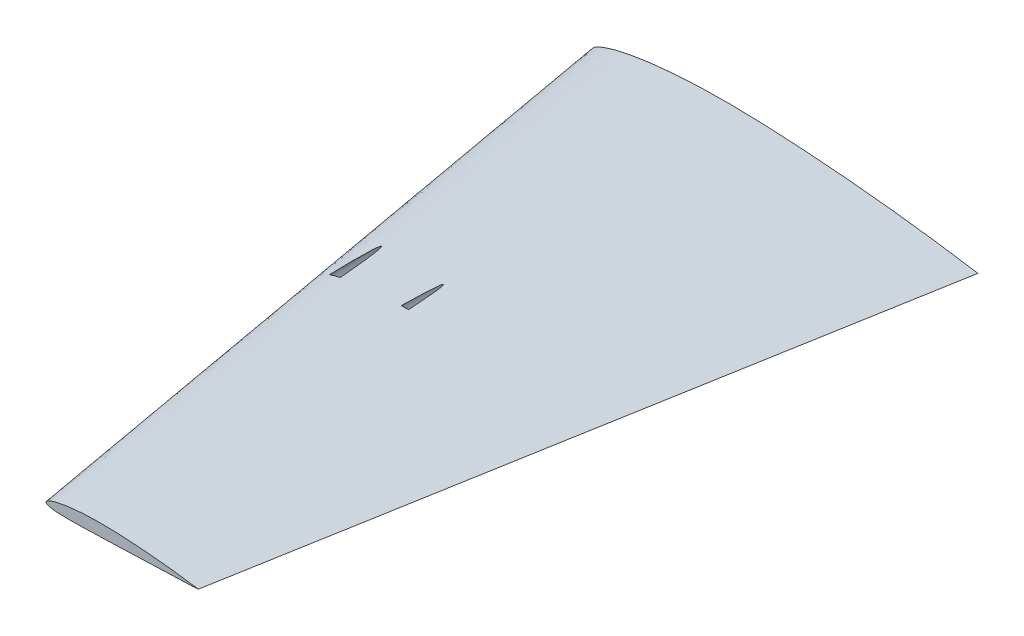
ISO-10303-21;
HEADER;
FILE_DESCRIPTION(('STEP AP214'),'2;1');
FILE_NAME('part.step','',(''),(''),'','','');
FILE_SCHEMA(('AUTOMOTIVE_DESIGN { 1 0 10303 214 1 1 1 1 }'));
ENDSEC;
DATA;
#1=APPLICATION_CONTEXT('core data for automotive mechanical design processes');
#2=APPLICATION_PROTOCOL_DEFINITION('international standard','automotive_design',2000,#1);
#3=PRODUCT_CONTEXT('',#1,'mechanical');
#4=PRODUCT('Part','Part','',(#3));
#5=PRODUCT_RELATED_PRODUCT_CATEGORY('part','',(#4));
#6=PRODUCT_DEFINITION_FORMATION('','',#4);
#7=PRODUCT_DEFINITION_CONTEXT('part definition',#1,'design');
#8=PRODUCT_DEFINITION('design','',#6,#7);
#9=PRODUCT_DEFINITION_SHAPE('','',#8);
#10=(LENGTH_UNIT() NAMED_UNIT(*) SI_UNIT(.MILLI.,.METRE.));
#11=(NAMED_UNIT(*) PLANE_ANGLE_UNIT() SI_UNIT($,.RADIAN.));
#12=(NAMED_UNIT(*) SI_UNIT($,.STERADIAN.) SOLID_ANGLE_UNIT());
#13=UNCERTAINTY_MEASURE_WITH_UNIT(LENGTH_MEASURE(1.E-05),#10,'distance_accuracy_value','');
#14=(GEOMETRIC_REPRESENTATION_CONTEXT(3) GLOBAL_UNCERTAINTY_ASSIGNED_CONTEXT((#13)) GLOBAL_UNIT_ASSIGNED_CONTEXT((#10,
#11,#12)) REPRESENTATION_CONTEXT('',''));
#15=CARTESIAN_POINT('',(0.,0.,0.));
#16=DIRECTION('',(0.,0.,1.));
#17=DIRECTION('',(1.,0.,0.));
#18=AXIS2_PLACEMENT_3D('',#15,#16,#17);
#19=CARTESIAN_POINT('',(55.4064649526419,0.683348343401608,304.8));
#20=DIRECTION('',(0.,0.,-1.));
#21=DIRECTION('',(-1.,0.,0.));
#22=AXIS2_PLACEMENT_3D('',#19,#20,#21);
#23=PLANE('',#22);
#24=CARTESIAN_POINT('',(123.952,-0.210449087184836,304.8));
#25=CARTESIAN_POINT('',(122.790706343836,-0.0342273031484342,304.8));
#26=CARTESIAN_POINT('',(120.467124093883,0.318367242829571,304.8));
#27=CARTESIAN_POINT('',(115.810899397513,0.963076186824327,304.8));
#28=CARTESIAN_POINT('',(109.978584953169,1.67935282167523,304.8));
#29=CARTESIAN_POINT('',(102.9662396439,2.40089084984383,304.8));
#30=CARTESIAN_POINT('',(95.9424731318779,2.98052031405359,304.8));
#31=CARTESIAN_POINT('',(88.9093311385905,3.39949018685831,304.8));
#32=CARTESIAN_POINT('',(81.8568042084218,3.65623455701682,304.8));
#33=CARTESIAN_POINT('',(75.9658797393383,3.64454226280271,304.8));
#34=CARTESIAN_POINT('',(71.2477816960848,3.43544167153705,304.8));
#35=CARTESIAN_POINT('',(67.7128965410631,3.16843628604555,304.8));
#36=CARTESIAN_POINT('',(64.1847212290625,2.77303923837818,304.8));
#37=CARTESIAN_POINT('',(61.2581084835049,2.30694331405794,304.8));
#38=CARTESIAN_POINT('',(58.9281697884809,1.81032736893172,304.8));
#39=CARTESIAN_POINT('',(57.1852042237573,1.37998192647884,304.8));
#40=CARTESIAN_POINT('',(55.7320959132784,0.809837774369731,304.8));
#41=CARTESIAN_POINT('',(54.5654760035073,0.355946309114248,304.8));
#42=CARTESIAN_POINT('',(53.3853953115185,-0.710813052215074,304.8));
#43=CARTESIAN_POINT('',(54.761560506712,-1.49399969401676,304.8));
#44=CARTESIAN_POINT('',(55.9743801762301,-1.75786460812164,304.8));
#45=CARTESIAN_POINT('',(57.5042732088365,-1.98721640481284,304.8));
#46=CARTESIAN_POINT('',(59.2669922488575,-2.11779793837691,304.8));
#47=CARTESIAN_POINT('',(61.6125691962496,-2.21911791515392,304.8));
#48=CARTESIAN_POINT('',(64.5246649381679,-2.2520217936348,304.8));
#49=CARTESIAN_POINT('',(68.0110664044848,-2.21402525142196,304.8));
#50=CARTESIAN_POINT('',(71.4871936874957,-2.13488754961327,304.8));
#51=CARTESIAN_POINT('',(76.1153973510382,-1.99846459470955,304.8));
#52=CARTESIAN_POINT('',(81.9127572556462,-1.81547105963111,304.8));
#53=CARTESIAN_POINT('',(88.8828697086837,-1.58169653441289,304.8));
#54=CARTESIAN_POINT('',(95.8723985528679,-1.310632769524,304.8));
#55=CARTESIAN_POINT('',(102.872094777363,-1.04510946434211,304.8));
#56=CARTESIAN_POINT('',(109.884310300863,-0.79007690257827,304.8));
#57=CARTESIAN_POINT('',(115.736638740901,-0.593669620344815,304.8));
#58=CARTESIAN_POINT('',(119.251823206111,-0.479271837733113,304.8));
#59=CARTESIAN_POINT('',(120.424928472982,-0.44109442695188,304.8));
#60=B_SPLINE_CURVE_WITH_KNOTS('',3,(#24,#25,#26,#27,#28,#29,#30,#31,#32,#33,#34,#35,#36,#37,#38,
#39,#40,#41,#42,#43,#44,#45,#46,#47,#48,#49,#50,#51,#52,#53,#54,#55,#56,#57,#58,#59),
.UNSPECIFIED.,.F.,.F.,(4,1,1,1,1,1,1,1,1,1,1,1,1,1,1,1,1,1,1,1,1,1,1,1,1,1,1,1,1,1,1,1,1,4),(0.,
0.0255158473215281,0.0510535553295715,0.102111638343893,0.153156698624328,0.2041805489657,
0.255198388322243,0.306198821045907,0.357469283972498,0.383114062596156,0.408777820460856,
0.434465463977822,0.460211086520082,0.473144435406998,0.486143688963209,0.499400538642225,
0.506172720054022,0.515220450047496,0.524256147452752,0.531058294108782,0.544124425529066,
0.55697037053682,0.569702534234132,0.595038372382182,0.620262585931604,0.645429077809132,
0.67057348925881,0.720845485800824,0.771430884013805,0.822072719977054,0.872795897802648,
0.923597705730035,0.974502637145741,1.),.UNSPECIFIED.);
#61=CARTESIAN_POINT('',(123.952,-0.210449087184837,304.8));
#62=VERTEX_POINT('',#61);
#63=CARTESIAN_POINT('',(120.424928472982,-0.44109442695188,304.8));
#64=VERTEX_POINT('',#63);
#65=EDGE_CURVE('E186',#62,#64,#60,.T.);
#66=ORIENTED_EDGE('',*,*,#65,.T.);
#67=DIRECTION('',(0.997868719044229,0.0652535022280712,0.));
#68=VECTOR('',#67,1.);
#69=CARTESIAN_POINT('',(120.424928472982,-0.44109442695188,304.8));
#70=LINE('',#69,#68);
#71=EDGE_CURVE('E113',#64,#62,#70,.T.);
#72=ORIENTED_EDGE('',*,*,#71,.T.);
#73=EDGE_LOOP('',(#66,#72));
#74=FACE_BOUND('',#73,.T.);
#75=ADVANCED_FACE('F60',(#74),#23,.F.);
#76=CARTESIAN_POINT('',(3.96627708992465,3.38381364018916,0.));
#77=DIRECTION('',(0.,0.,-1.));
#78=DIRECTION('',(-1.,0.,0.));
#79=AXIS2_PLACEMENT_3D('',#76,#77,#78);
#80=PLANE('',#79);
#81=CARTESIAN_POINT('',(66.6145908322065,3.92359741611896,0.));
#82=DIRECTION('',(0.,0.,-1.));
#83=DIRECTION('',(-1.,0.,0.));
#84=AXIS2_PLACEMENT_3D('',#81,#82,#83);
#85=CIRCLE('',#84,3.556);
#86=CARTESIAN_POINT('',(63.0585908322065,3.92359741611896,0.));
#87=VERTEX_POINT('',#86);
#88=EDGE_CURVE('E327',#87,#87,#85,.T.);
#89=ORIENTED_EDGE('',*,*,#88,.F.);
#90=EDGE_LOOP('',(#89));
#91=FACE_BOUND('',#90,.T.);
#92=CARTESIAN_POINT('',(34.9854091677935,1.15640258388104,0.));
#93=DIRECTION('',(0.,0.,-1.));
#94=DIRECTION('',(-1.,0.,0.));
#95=AXIS2_PLACEMENT_3D('',#92,#93,#94);
#96=CIRCLE('',#95,3.556);
#97=CARTESIAN_POINT('',(31.4294091677935,1.15640258388104,0.));
#98=VERTEX_POINT('',#97);
#99=EDGE_CURVE('E119',#98,#98,#96,.T.);
#100=ORIENTED_EDGE('',*,*,#99,.F.);
#101=EDGE_LOOP('',(#100));
#102=FACE_BOUND('',#101,.T.);
#103=CARTESIAN_POINT('',(177.8,0.149352,0.));
#104=CARTESIAN_POINT('',(174.857195049521,0.612681625122355,0.));
#105=CARTESIAN_POINT('',(168.969063902231,1.53973783273871,0.));
#106=CARTESIAN_POINT('',(157.168969239347,3.2405873734949,0.));
#107=CARTESIAN_POINT('',(142.387066218281,5.13954993005009,0.));
#108=CARTESIAN_POINT('',(124.612423323689,7.06851398771198,0.));
#109=CARTESIAN_POINT('',(106.806810582949,8.63772837976143,0.));
#110=CARTESIAN_POINT('',(88.975151697433,9.79960755707183,0.));
#111=CARTESIAN_POINT('',(71.0920384127062,10.5503213239505,0.));
#112=CARTESIAN_POINT('',(56.1512115576386,10.6038241747413,0.));
#113=CARTESIAN_POINT('',(44.1821401860872,10.1401010113974,0.));
#114=CARTESIAN_POINT('',(35.2131358681503,9.5128163495268,0.));
#115=CARTESIAN_POINT('',(26.2593367738904,8.55980787572253,0.));
#116=CARTESIAN_POINT('',(18.8302327928316,7.41899998659591,0.));
#117=CARTESIAN_POINT('',(12.913992758507,6.19236397962518,0.));
#118=CARTESIAN_POINT('',(8.48737934114215,5.12551854924347,0.));
#119=CARTESIAN_POINT('',(4.79393335490391,3.7000216159676,0.));
#120=CARTESIAN_POINT('',(1.82872511104503,2.56532259711233,0.));
#121=CARTESIAN_POINT('',(-1.17927391697623,-0.123552282536533,0.));
#122=CARTESIAN_POINT('',(2.29992385423439,-2.12930955161099,0.));
#123=CARTESIAN_POINT('',(5.37217276551407,-2.81564850638312,0.));
#124=CARTESIAN_POINT('',(9.24907566939319,-3.41893055998174,0.));
#125=CARTESIAN_POINT('',(13.7178700663076,-3.77499641129469,0.));
#126=CARTESIAN_POINT('',(19.665331559494,-4.06507630656292,0.));
#127=CARTESIAN_POINT('',(27.0505733264275,-4.18963519348183,0.));
#128=CARTESIAN_POINT('',(35.8933797787478,-4.14248221306535,0.));
#129=CARTESIAN_POINT('',(44.7107094282913,-3.99084129943251,0.));
#130=CARTESIAN_POINT('',(56.4507632339333,-3.71017542029488,0.));
#131=CARTESIAN_POINT('',(71.1567081757834,-3.32790041098022,0.));
#132=CARTESIAN_POINT('',(88.8377247038045,-2.83338852479331,0.));
#133=CARTESIAN_POINT('',(106.568511789586,-2.24457712549779,0.));
#134=CARTESIAN_POINT('',(124.32500734663,-1.66996105742068,0.));
#135=CARTESIAN_POINT('',(142.113106471878,-1.12212851342749,0.));
#136=CARTESIAN_POINT('',(156.958652888787,-0.706609275659402,0.));
#137=CARTESIAN_POINT('',(165.875537757121,-0.466092487718349,0.));
#138=CARTESIAN_POINT('',(168.851326,-0.385826,0.));
#139=B_SPLINE_CURVE_WITH_KNOTS('',3,(#103,#104,#105,#106,#107,#108,#109,#110,#111,#112,#113,
#114,#115,#116,#117,#118,#119,#120,#121,#122,#123,#124,#125,#126,#127,#128,#129,#130,#131,#132,
#133,#134,#135,#136,#137,#138),.UNSPECIFIED.,.F.,.F.,(4,1,1,1,1,1,1,1,1,1,1,1,1,1,1,1,1,1,1,1,1,
1,1,1,1,1,1,1,1,1,1,1,1,4),(0.,0.0255158473215281,0.0510535553295715,0.102111638343893,
0.153156698624328,0.2041805489657,0.255198388322243,0.306198821045907,0.357469283972498,
0.383114062596156,0.408777820460856,0.434465463977822,0.460211086520082,0.473144435406998,
0.486143688963209,0.499400538642225,0.506172720054022,0.515220450047496,0.524256147452752,
0.531058294108782,0.544124425529066,0.55697037053682,0.569702534234132,0.595038372382182,
0.620262585931604,0.645429077809132,0.67057348925881,0.720845485800824,0.771430884013805,
0.822072719977054,0.872795897802648,0.923597705730035,0.974502637145741,1.),.UNSPECIFIED.);
#140=CARTESIAN_POINT('',(177.8,0.149352,0.));
#141=VERTEX_POINT('',#140);
#142=CARTESIAN_POINT('',(0.,0.,0.));
#143=VERTEX_POINT('',#142);
#144=EDGE_CURVE('E175',#141,#143,#139,.T.);
#145=ORIENTED_EDGE('',*,*,#144,.F.);
#146=DIRECTION('',(0.998216446900987,0.0596986192166096,0.));
#147=VECTOR('',#146,1.);
#148=CARTESIAN_POINT('',(168.851326,-0.385826,0.));
#149=LINE('',#148,#147);
#150=CARTESIAN_POINT('',(168.851326,-0.385826,0.));
#151=VERTEX_POINT('',#150);
#152=EDGE_CURVE('E184',#151,#141,#149,.T.);
#153=ORIENTED_EDGE('',*,*,#152,.F.);
#154=EDGE_CURVE('E185',#143,#151,#139,.T.);
#155=ORIENTED_EDGE('',*,*,#154,.F.);
#156=EDGE_LOOP('',(#145,#153,#155));
#157=FACE_BOUND('',#156,.T.);
#158=ADVANCED_FACE('F154',(#91,#102,#157),#80,.T.);
#159=CARTESIAN_POINT('',(168.851326,-0.385826,0.));
#160=CARTESIAN_POINT('',(120.424928472982,-0.44109442695188,304.8));
#161=CARTESIAN_POINT('',(170.342771666667,-0.296629666666669,0.));
#162=CARTESIAN_POINT('',(121.012773727485,-0.402653536990706,304.8));
#163=CARTESIAN_POINT('',(171.834217333333,-0.207433333333337,0.));
#164=CARTESIAN_POINT('',(121.600618981988,-0.364212647029531,304.8));
#165=CARTESIAN_POINT('',(174.817108666667,-0.0290406666666699,0.));
#166=CARTESIAN_POINT('',(122.776309490994,-0.287330867107184,304.8));
#167=CARTESIAN_POINT('',(176.308554333333,0.0601556666666645,0.));
#168=CARTESIAN_POINT('',(123.364154745497,-0.24888997714601,304.8));
#169=CARTESIAN_POINT('',(177.8,0.149352,0.));
#170=CARTESIAN_POINT('',(123.952,-0.210449087184837,304.8));
#171=B_SPLINE_SURFACE_WITH_KNOTS('',3,1,((#159,#160),(#161,#162),(#163,#164),(#165,#166),(#167,
#168),(#169,#170)),.UNSPECIFIED.,.F.,.F.,.F.,(4,2,4),(2,2),(0.,0.5,1.),(0.,1.),.UNSPECIFIED.);
#172=DIRECTION('',(-0.173972470029645,-0.00116244770199261,0.984749830356484));
#173=VECTOR('',#172,1.);
#174=CARTESIAN_POINT('',(150.876,-0.0305485435924185,152.4));
#175=LINE('',#174,#173);
#176=EDGE_CURVE('E220',#141,#62,#175,.T.);
#177=DIRECTION('',(0.156911172495344,0.000179080710477262,-0.987612703379334));
#178=VECTOR('',#177,1.);
#179=CARTESIAN_POINT('',(144.638127236491,-0.41346021347594,152.4));
#180=LINE('',#179,#178);
#181=EDGE_CURVE('E203',#64,#151,#180,.T.);
#182=ORIENTED_EDGE('',*,*,#152,.T.);
#183=ORIENTED_EDGE('',*,*,#176,.T.);
#184=ORIENTED_EDGE('',*,*,#71,.F.);
#185=ORIENTED_EDGE('',*,*,#181,.T.);
#186=EDGE_LOOP('',(#182,#183,#184,#185));
#187=FACE_BOUND('',#186,.T.);
#188=ADVANCED_FACE('F157',(#187),#171,.T.);
#189=CARTESIAN_POINT('',(177.8,0.149352,0.));
#190=CARTESIAN_POINT('',(123.952,-0.210449087184836,304.8));
#191=CARTESIAN_POINT('',(174.857195049521,0.612681625122355,0.));
#192=CARTESIAN_POINT('',(122.790706343836,-0.0342273031484342,304.8));
#193=CARTESIAN_POINT('',(168.969063902231,1.53973783273871,0.));
#194=CARTESIAN_POINT('',(120.467124093883,0.318367242829571,304.8));
#195=CARTESIAN_POINT('',(157.168969239347,3.2405873734949,0.));
#196=CARTESIAN_POINT('',(115.810899397513,0.963076186824327,304.8));
#197=CARTESIAN_POINT('',(142.387066218281,5.13954993005009,0.));
#198=CARTESIAN_POINT('',(109.978584953169,1.67935282167523,304.8));
#199=CARTESIAN_POINT('',(124.612423323689,7.06851398771198,0.));
#200=CARTESIAN_POINT('',(102.9662396439,2.40089084984383,304.8));
#201=CARTESIAN_POINT('',(106.806810582949,8.63772837976143,0.));
#202=CARTESIAN_POINT('',(95.9424731318779,2.98052031405359,304.8));
#203=CARTESIAN_POINT('',(88.975151697433,9.79960755707183,0.));
#204=CARTESIAN_POINT('',(88.9093311385905,3.39949018685831,304.8));
#205=CARTESIAN_POINT('',(71.0920384127062,10.5503213239505,0.));
#206=CARTESIAN_POINT('',(81.8568042084218,3.65623455701682,304.8));
#207=CARTESIAN_POINT('',(56.1512115576386,10.6038241747413,0.));
#208=CARTESIAN_POINT('',(75.9658797393383,3.64454226280271,304.8));
#209=CARTESIAN_POINT('',(44.1821401860872,10.1401010113974,0.));
#210=CARTESIAN_POINT('',(71.2477816960848,3.43544167153705,304.8));
#211=CARTESIAN_POINT('',(35.2131358681503,9.5128163495268,0.));
#212=CARTESIAN_POINT('',(67.7128965410631,3.16843628604555,304.8));
#213=CARTESIAN_POINT('',(26.2593367738904,8.55980787572253,0.));
#214=CARTESIAN_POINT('',(64.1847212290625,2.77303923837818,304.8));
#215=CARTESIAN_POINT('',(18.8302327928316,7.41899998659591,0.));
#216=CARTESIAN_POINT('',(61.2581084835049,2.30694331405794,304.8));
#217=CARTESIAN_POINT('',(12.913992758507,6.19236397962518,0.));
#218=CARTESIAN_POINT('',(58.9281697884809,1.81032736893172,304.8));
#219=CARTESIAN_POINT('',(8.48737934114215,5.12551854924347,0.));
#220=CARTESIAN_POINT('',(57.1852042237573,1.37998192647884,304.8));
#221=CARTESIAN_POINT('',(4.79393335490391,3.7000216159676,0.));
#222=CARTESIAN_POINT('',(55.7320959132784,0.809837774369731,304.8));
#223=CARTESIAN_POINT('',(1.82872511104503,2.56532259711233,0.));
#224=CARTESIAN_POINT('',(54.5654760035073,0.355946309114248,304.8));
#225=CARTESIAN_POINT('',(-1.17927391697623,-0.123552282536533,0.));
#226=CARTESIAN_POINT('',(53.3853953115185,-0.710813052215074,304.8));
#227=CARTESIAN_POINT('',(2.29992385423439,-2.12930955161099,0.));
#228=CARTESIAN_POINT('',(54.761560506712,-1.49399969401676,304.8));
#229=CARTESIAN_POINT('',(5.37217276551407,-2.81564850638312,0.));
#230=CARTESIAN_POINT('',(55.9743801762301,-1.75786460812164,304.8));
#231=CARTESIAN_POINT('',(9.24907566939319,-3.41893055998174,0.));
#232=CARTESIAN_POINT('',(57.5042732088365,-1.98721640481284,304.8));
#233=CARTESIAN_POINT('',(13.7178700663076,-3.77499641129469,0.));
#234=CARTESIAN_POINT('',(59.2669922488575,-2.11779793837691,304.8));
#235=CARTESIAN_POINT('',(19.665331559494,-4.06507630656292,0.));
#236=CARTESIAN_POINT('',(61.6125691962496,-2.21911791515392,304.8));
#237=CARTESIAN_POINT('',(27.0505733264275,-4.18963519348183,0.));
#238=CARTESIAN_POINT('',(64.5246649381679,-2.2520217936348,304.8));
#239=CARTESIAN_POINT('',(35.8933797787478,-4.14248221306535,0.));
#240=CARTESIAN_POINT('',(68.0110664044848,-2.21402525142196,304.8));
#241=CARTESIAN_POINT('',(44.7107094282913,-3.99084129943251,0.));
#242=CARTESIAN_POINT('',(71.4871936874957,-2.13488754961327,304.8));
#243=CARTESIAN_POINT('',(56.4507632339333,-3.71017542029488,0.));
#244=CARTESIAN_POINT('',(76.1153973510382,-1.99846459470955,304.8));
#245=CARTESIAN_POINT('',(71.1567081757834,-3.32790041098022,0.));
#246=CARTESIAN_POINT('',(81.9127572556462,-1.81547105963111,304.8));
#247=CARTESIAN_POINT('',(88.8377247038045,-2.83338852479331,0.));
#248=CARTESIAN_POINT('',(88.8828697086837,-1.58169653441289,304.8));
#249=CARTESIAN_POINT('',(106.568511789586,-2.24457712549779,0.));
#250=CARTESIAN_POINT('',(95.8723985528679,-1.310632769524,304.8));
#251=CARTESIAN_POINT('',(124.32500734663,-1.66996105742068,0.));
#252=CARTESIAN_POINT('',(102.872094777363,-1.04510946434211,304.8));
#253=CARTESIAN_POINT('',(142.113106471878,-1.12212851342749,0.));
#254=CARTESIAN_POINT('',(109.884310300863,-0.79007690257827,304.8));
#255=CARTESIAN_POINT('',(156.958652888787,-0.706609275659402,0.));
#256=CARTESIAN_POINT('',(115.736638740901,-0.593669620344815,304.8));
#257=CARTESIAN_POINT('',(165.875537757121,-0.466092487718349,0.));
#258=CARTESIAN_POINT('',(119.251823206111,-0.479271837733113,304.8));
#259=CARTESIAN_POINT('',(168.851326,-0.385826,0.));
#260=CARTESIAN_POINT('',(120.424928472982,-0.44109442695188,304.8));
#261=B_SPLINE_SURFACE_WITH_KNOTS('',3,1,((#189,#190),(#191,#192),(#193,#194),(#195,#196),(#197,
#198),(#199,#200),(#201,#202),(#203,#204),(#205,#206),(#207,#208),(#209,#210),(#211,#212),(#213,
#214),(#215,#216),(#217,#218),(#219,#220),(#221,#222),(#223,#224),(#225,#226),(#227,#228),(#229,
#230),(#231,#232),(#233,#234),(#235,#236),(#237,#238),(#239,#240),(#241,#242),(#243,#244),(#245,
#246),(#247,#248),(#249,#250),(#251,#252),(#253,#254),(#255,#256),(#257,#258),(#259,#260)),
.UNSPECIFIED.,.F.,.F.,.F.,(4,1,1,1,1,1,1,1,1,1,1,1,1,1,1,1,1,1,1,1,1,1,1,1,1,1,1,1,1,1,1,1,1,4),
(2,2),(0.,0.0255158473215281,0.0510535553295715,0.102111638343893,0.153156698624328,
0.2041805489657,0.255198388322243,0.306198821045907,0.357469283972498,0.383114062596156,
0.408777820460856,0.434465463977822,0.460211086520082,0.473144435406998,0.486143688963209,
0.499400538642225,0.506172720054022,0.515220450047496,0.524256147452752,0.531058294108782,
0.544124425529066,0.55697037053682,0.569702534234132,0.595038372382182,0.620262585931604,
0.645429077809132,0.67057348925881,0.720845485800824,0.771430884013805,0.822072719977054,
0.872795897802648,0.923597705730035,0.974502637145741,1.),(0.,1.),.UNSPECIFIED.);
#262=CARTESIAN_POINT('',(68.2466219190827,7.08296610803387,152.4));
#263=CARTESIAN_POINT('',(68.2336056626302,7.08968952080345,152.105104138697));
#264=CARTESIAN_POINT('',(68.220397251114,7.09641103535035,151.810216666588));
#265=CARTESIAN_POINT('',(68.1935634647631,7.10985026873692,151.220450628958));
#266=CARTESIAN_POINT('',(68.1799380758596,7.11656798744073,150.925572064073));
#267=CARTESIAN_POINT('',(68.152238256637,7.12999932105125,150.335829506722));
#268=CARTESIAN_POINT('',(68.1381638166023,7.13671293586596,150.040965514711));
#269=CARTESIAN_POINT('',(68.1095278933859,7.15013569954822,149.451258078269));
#270=CARTESIAN_POINT('',(68.0949664052962,7.15684484837006,149.156414634076));
#271=CARTESIAN_POINT('',(68.065205200744,7.17030692634001,148.564615428296));
#272=CARTESIAN_POINT('',(68.0500016205664,7.17705982000171,148.267659859987));
#273=CARTESIAN_POINT('',(68.0190039417406,7.19056016930604,147.673782419764));
#274=CARTESIAN_POINT('',(68.0032098491102,7.19730762500338,147.376860547537));
#275=CARTESIAN_POINT('',(67.9709696285039,7.21079651963321,146.783057605419));
#276=CARTESIAN_POINT('',(67.9545235127598,7.21753795867614,146.486176534867));
#277=CARTESIAN_POINT('',(67.9209057637668,7.23101412608039,145.892462941095));
#278=CARTESIAN_POINT('',(67.9037341492406,7.23774885461028,145.595630416821));
#279=CARTESIAN_POINT('',(67.8685791659822,7.25120970472832,145.002068846046));
#280=CARTESIAN_POINT('',(67.8505959495347,7.2579358276896,144.705339790573));
#281=CARTESIAN_POINT('',(67.8137050763819,7.27137975287607,144.111936121035));
#282=CARTESIAN_POINT('',(67.7947974112621,7.27809755502495,143.815261507489));
#283=CARTESIAN_POINT('',(67.7559194885991,7.29152378485072,143.221965866651));
#284=CARTESIAN_POINT('',(67.7359491753119,7.29823221201685,142.925344842991));
#285=CARTESIAN_POINT('',(67.6947688871545,7.31163823628542,142.332157980842));
#286=CARTESIAN_POINT('',(67.6735587863613,7.31833583221651,142.035592151038));
#287=CARTESIAN_POINT('',(67.6298095594315,7.33167412528554,141.444471729499));
#288=CARTESIAN_POINT('',(67.6072798374181,7.33831491170697,141.149916446273));
#289=CARTESIAN_POINT('',(67.5604607834405,7.35157918122746,140.560951836961));
#290=CARTESIAN_POINT('',(67.5361714951223,7.3582026647515,140.266542507438));
#291=CARTESIAN_POINT('',(67.4853951137922,7.37142634520685,139.677963037011));
#292=CARTESIAN_POINT('',(67.4589083983133,7.37802654593599,139.383792863753));
#293=CARTESIAN_POINT('',(67.4030882461765,7.39119539096865,138.795798328661));
#294=CARTESIAN_POINT('',(67.3737555881239,7.39776404339004,138.50197389438));
#295=CARTESIAN_POINT('',(67.3323132971702,7.40642898939049,138.113370174743));
#296=CARTESIAN_POINT('',(67.3219759404733,7.40854477426729,138.018401804018));
#297=CARTESIAN_POINT('',(67.3008244278623,7.41277157313944,137.828493426061));
#298=CARTESIAN_POINT('',(67.2900101512721,7.41488258578356,137.733553432199));
#299=CARTESIAN_POINT('',(67.2678342123732,7.41909973653993,137.543677862107));
#300=CARTESIAN_POINT('',(67.2564722170232,7.42120587084907,137.448742324613));
#301=CARTESIAN_POINT('',(67.2329659496718,7.42543876666726,137.257686838156));
#302=CARTESIAN_POINT('',(67.2208132881398,7.42756543032685,137.161567915923));
#303=CARTESIAN_POINT('',(67.1957559389795,7.43180843384714,136.969485322806));
#304=CARTESIAN_POINT('',(67.1828516993134,7.43392477905895,136.87352159378));
#305=CARTESIAN_POINT('',(67.1561590772798,7.43814182005847,136.681923148465));
#306=CARTESIAN_POINT('',(67.1423726234071,7.44024253948359,136.586288165647));
#307=CARTESIAN_POINT('',(67.117158234909,7.4439216021536,136.418378398078));
#308=CARTESIAN_POINT('',(67.1059700383851,7.44550297725983,136.346067751325));
#309=CARTESIAN_POINT('',(67.0828128582125,7.44865641252974,136.201535912933));
#310=CARTESIAN_POINT('',(67.0708435095933,7.45022846795946,136.129314779408));
#311=CARTESIAN_POINT('',(67.0459058181478,7.45336542095588,135.984778474128));
#312=CARTESIAN_POINT('',(67.0329340640547,7.45493027298551,135.91246388591));
#313=CARTESIAN_POINT('',(67.0056730288018,7.45805358005368,135.767574424789));
#314=CARTESIAN_POINT('',(66.9913754157822,7.45961191990011,135.695001108387));
#315=CARTESIAN_POINT('',(66.9614517801776,7.46267168690731,135.551746471575));
#316=CARTESIAN_POINT('',(66.9458608476044,7.46417361776065,135.481057969877));
#317=CARTESIAN_POINT('',(66.9207884537237,7.46639975042604,135.375471025335));
#318=CARTESIAN_POINT('',(66.9121559531246,7.46713687844864,135.3403716325));
#319=CARTESIAN_POINT('',(66.8941893153032,7.46859984715532,135.270362773359));
#320=CARTESIAN_POINT('',(66.8848553894594,7.46932569116096,135.235453253208));
#321=CARTESIAN_POINT('',(66.8653822429473,7.47075604849572,135.166207729751));
#322=CARTESIAN_POINT('',(66.8552513487032,7.47146069766024,135.13186941441));
#323=CARTESIAN_POINT('',(66.8338017379794,7.4728506106675,135.063519553984));
#324=CARTESIAN_POINT('',(66.8224816561337,7.4735358510548,135.02950843455));
#325=CARTESIAN_POINT('',(66.7982808796083,7.47487073609284,134.962342981947));
#326=CARTESIAN_POINT('',(66.7854139515793,7.47552062944881,134.929183874855));
#327=CARTESIAN_POINT('',(66.7641934971269,7.4764559713231,134.880309861071));
#328=CARTESIAN_POINT('',(66.7568076829062,7.47676090627648,134.864177088226));
#329=CARTESIAN_POINT('',(66.741179027941,7.47735223488249,134.832334813522));
#330=CARTESIAN_POINT('',(66.7329367757868,7.47763864105231,134.816625030188));
#331=CARTESIAN_POINT('',(66.7199722337007,7.4780379518142,134.794091757391));
#332=CARTESIAN_POINT('',(66.715718278581,7.47816189425824,134.78699924142));
#333=CARTESIAN_POINT('',(66.7068928996997,7.47840203961349,134.77300723508));
#334=CARTESIAN_POINT('',(66.7023213017619,7.47851823820893,134.766107853569));
#335=CARTESIAN_POINT('',(66.6928216692539,7.478739944329,134.752610578958));
#336=CARTESIAN_POINT('',(66.687895625444,7.4788455046259,134.746011296912));
#337=CARTESIAN_POINT('',(66.6775814536355,7.47904321498242,134.733184043053));
#338=CARTESIAN_POINT('',(66.6721935813292,7.47913537238733,134.726955868972));
#339=CARTESIAN_POINT('',(66.6616549745886,7.47928927661305,134.715892690474));
#340=CARTESIAN_POINT('',(66.6565806110032,7.47935348794625,134.710985854));
#341=CARTESIAN_POINT('',(66.6459128450891,7.47946347861309,134.70173132105));
#342=CARTESIAN_POINT('',(66.6403181850812,7.47950921177695,134.697385043396));
#343=CARTESIAN_POINT('',(66.6284557857111,7.47957541565957,134.689474634157));
#344=CARTESIAN_POINT('',(66.6221788022394,7.47959547548619,134.6859239568));
#345=CARTESIAN_POINT('',(66.6090540640259,7.47959906137061,134.680125927745));
#346=CARTESIAN_POINT('',(66.6022092559138,7.47958276591281,134.677872276728));
#347=CARTESIAN_POINT('',(66.5904466838544,7.47951862842015,134.675530369163));
#348=CARTESIAN_POINT('',(66.585621241254,7.47948268688359,134.674977628296));
#349=CARTESIAN_POINT('',(66.5759473459688,7.47939074268986,134.67471179197));
#350=CARTESIAN_POINT('',(66.5710988924475,7.47933473929773,134.674998727276));
#351=CARTESIAN_POINT('',(66.5567824754681,7.47914012371183,134.677084016295));
#352=CARTESIAN_POINT('',(66.547483643319,7.47897456376297,134.680095640842));
#353=CARTESIAN_POINT('',(66.5316499729119,7.47863737402354,134.687561403319));
#354=CARTESIAN_POINT('',(66.524921468559,7.47847247517907,134.691647818518));
#355=CARTESIAN_POINT('',(66.5121325017516,7.47812675872809,134.700779497983));
#356=CARTESIAN_POINT('',(66.5060742140924,7.47794589253619,134.705827746935));
#357=CARTESIAN_POINT('',(66.4930376762509,7.477526814104,134.717952793929));
#358=CARTESIAN_POINT('',(66.4862353335721,7.47728601040182,134.725214245663));
#359=CARTESIAN_POINT('',(66.4733627311795,7.47679764066251,134.740334756823));
#360=CARTESIAN_POINT('',(66.4672919569725,7.47655007952978,134.748193389849));
#361=CARTESIAN_POINT('',(66.4556773948406,7.47604959837295,134.764360856877));
#362=CARTESIAN_POINT('',(66.4501371434897,7.47579665450449,134.772672201025));
#363=CARTESIAN_POINT('',(66.4395100424003,7.47528868490849,134.789575015134));
#364=CARTESIAN_POINT('',(66.4344231333901,7.47503365945787,134.798166448273));
#365=CARTESIAN_POINT('',(66.4201365631849,7.47428924011963,134.823482660763));
#366=CARTESIAN_POINT('',(66.4114178950687,7.47379825460979,134.84047798674));
#367=CARTESIAN_POINT('',(66.3949123112822,7.47281490895148,134.87491856378));
#368=CARTESIAN_POINT('',(66.3871260578766,7.47232254807716,134.892364124065));
#369=CARTESIAN_POINT('',(66.3647783197149,7.47084360829624,134.945201900902));
#370=CARTESIAN_POINT('',(66.3512600924062,7.46985697033533,134.981033092069));
#371=CARTESIAN_POINT('',(66.3259414700926,7.46788522848604,135.053341396858));
#372=CARTESIAN_POINT('',(66.3141439653525,7.46690012986686,135.089819484397));
#373=CARTESIAN_POINT('',(66.2918008199745,7.46493441051151,135.163099881736));
#374=CARTESIAN_POINT('',(66.2812534730491,7.46395378547017,135.199901674228));
#375=CARTESIAN_POINT('',(66.2511879774172,7.46103725320442,135.30988243133));
#376=CARTESIAN_POINT('',(66.2329907600665,7.45910552822361,135.383419599215));
#377=CARTESIAN_POINT('',(66.1988360182799,7.45525062826446,135.531018219546));
#378=CARTESIAN_POINT('',(66.1828791078359,7.45332745576937,135.605079809899));
#379=CARTESIAN_POINT('',(66.1525505269864,7.4494857980109,135.753616004211));
#380=CARTESIAN_POINT('',(66.1381807443107,7.44756732092746,135.828090991657));
#381=CARTESIAN_POINT('',(66.1106531011314,7.44373584078279,135.97726581393));
#382=CARTESIAN_POINT('',(66.0974952951187,7.44182283797143,136.051965658712));
#383=CARTESIAN_POINT('',(66.059490155285,7.43609797532761,136.276009696475));
#384=CARTESIAN_POINT('',(66.0360534609057,7.43229266954471,136.425592873695));
#385=CARTESIAN_POINT('',(65.9917432868584,7.42469661692719,136.725028479875));
#386=CARTESIAN_POINT('',(65.9708681113291,7.42090586208736,136.874880663322));
#387=CARTESIAN_POINT('',(65.9244309930454,7.4120851026014,137.224253837047));
#388=CARTESIAN_POINT('',(65.8995913027632,7.40705834489564,137.423870564825));
#389=CARTESIAN_POINT('',(65.8522983844918,7.39701455253608,137.82338885778));
#390=CARTESIAN_POINT('',(65.8298452309673,7.39199751819047,138.023290431647));
#391=CARTESIAN_POINT('',(65.7867631532961,7.3819679480631,138.423375744815));
#392=CARTESIAN_POINT('',(65.7661350132092,7.37695541512184,138.623559568215));
#393=CARTESIAN_POINT('',(65.726343732315,7.3669347832676,139.024073306581));
#394=CARTESIAN_POINT('',(65.7071806016993,7.3619266843857,139.224403222555));
#395=CARTESIAN_POINT('',(65.6514767083532,7.34690506623637,139.82562011531));
#396=CARTESIAN_POINT('',(65.6167278387342,7.33689575505448,140.226673153553));
#397=CARTESIAN_POINT('',(65.5506490524863,7.31687715078627,141.029179489644));
#398=CARTESIAN_POINT('',(65.5193201830446,7.30686785863867,141.430632872317));
#399=CARTESIAN_POINT('',(65.4593106581956,7.28684941055601,142.233655967636));
#400=CARTESIAN_POINT('',(65.4306294750118,7.27684025499318,142.635225641023));
#401=CARTESIAN_POINT('',(65.375380750736,7.25681733262736,143.438487989494));
#402=CARTESIAN_POINT('',(65.3488130984238,7.24680356609495,143.840180656988));
#403=CARTESIAN_POINT('',(65.2807912340857,7.22029048799675,144.903474816459));
#404=CARTESIAN_POINT('',(65.2408204398261,7.20378474450491,145.565170962553));
#405=CARTESIAN_POINT('',(65.1644557380508,7.17074505710119,146.888802043255));
#406=CARTESIAN_POINT('',(65.1280620217933,7.15421111172945,147.550736988733));
#407=CARTESIAN_POINT('',(65.0581483175433,7.12111482644315,148.874619471928));
#408=CARTESIAN_POINT('',(65.024627735034,7.1045524931297,149.536566978553));
#409=CARTESIAN_POINT('',(64.9599493162665,7.07139299817188,150.860567475422));
#410=CARTESIAN_POINT('',(64.9287914491164,7.05479583698581,151.522620464173));
#411=CARTESIAN_POINT('',(64.8953642327681,7.03637907665285,152.256478158388));
#412=CARTESIAN_POINT('',(64.8921072973428,7.03457797713656,152.328238825424));
#413=CARTESIAN_POINT('',(64.8888618694052,7.03277665619969,152.4));
#414=B_SPLINE_CURVE_WITH_KNOTS('',3,(#262,#263,#264,#265,#266,#267,#268,#269,#270,#271,#272,
#273,#274,#275,#276,#277,#278,#279,#280,#281,#282,#283,#284,#285,#286,#287,#288,#289,#290,#291,
#292,#293,#294,#295,#296,#297,#298,#299,#300,#301,#302,#303,#304,#305,#306,#307,#308,#309,#310,
#311,#312,#313,#314,#315,#316,#317,#318,#319,#320,#321,#322,#323,#324,#325,#326,#327,#328,#329,
#330,#331,#332,#333,#334,#335,#336,#337,#338,#339,#340,#341,#342,#343,#344,#345,#346,#347,#348,
#349,#350,#351,#352,#353,#354,#355,#356,#357,#358,#359,#360,#361,#362,#363,#364,#365,#366,#367,
#368,#369,#370,#371,#372,#373,#374,#375,#376,#377,#378,#379,#380,#381,#382,#383,#384,#385,#386,
#387,#388,#389,#390,#391,#392,#393,#394,#395,#396,#397,#398,#399,#400,#401,#402,#403,#404,#405,
#406,#407,#408,#409,#410,#411,#412,#413),.UNSPECIFIED.,.F.,.F.,(4,2,2,2,2,2,2,2,2,2,2,2,2,2,2,2,
2,2,2,2,2,2,2,2,2,2,2,2,2,2,2,2,2,2,2,2,2,2,2,2,2,2,2,2,2,2,2,2,2,2,2,2,2,2,2,2,2,2,2,2,2,2,2,2,
2,2,2,2,2,2,2,2,2,2,2,4),(0.,0.885778630942354,1.77158718101904,2.657414909673,3.54325156759388,
4.43551458142685,5.32776850504834,6.2200056982353,7.1122198797743,8.00426734140414,
8.89632292393029,9.78842534770823,10.6806185385896,11.56708519944,12.4535298791065,
13.3398225757375,14.2258734766649,14.5125308323405,14.7992611424597,15.0861680543691,
15.3768878850482,15.6674361772126,15.957369709219,16.1769308045852,16.3965952282433,
16.6170432300967,16.8389849651625,17.056164077452,17.1646171835934,17.2730377368478,
17.3804466692642,17.4879802997512,17.5946193273758,17.647840925969,17.7010261867471,
17.725834022579,17.7506555705475,17.7753472066375,17.8000252593744,17.821172364488,
17.8423719860366,17.8639068224897,17.885336167529,17.8998383007351,17.9143409652798,
17.9431734851522,17.966696993434,17.9902947232671,18.0200862703098,18.0498567419166,
18.0798135638764,18.1097664633935,18.1670411439129,18.2243562665324,18.3391958518185,
18.4542261628217,18.569097620454,18.7963725157818,19.0237095783324,19.2513141881136,
19.4789290260904,19.9332585102122,20.3872855623502,20.9909204972754,21.5945742613191,
22.1984861195509,22.8024021785966,24.010418591805,25.2188038622764,26.4269477368112,
27.635027993118,29.6243370742476,31.6137524614264,33.6027551944277,35.5917319173279,
35.8073032558112),.UNSPECIFIED.);
#415=CARTESIAN_POINT('',(68.2466219190933,7.08296610803115,152.4));
#416=VERTEX_POINT('',#415);
#417=CARTESIAN_POINT('',(64.8888618693942,7.03277665619945,152.4));
#418=VERTEX_POINT('',#417);
#419=EDGE_CURVE('E12',#416,#418,#414,.T.);
#420=CARTESIAN_POINT('',(70.2132628322065,7.09105554281612,152.4));
#421=CARTESIAN_POINT('',(69.9133142025782,7.09096184293044,152.4));
#422=CARTESIAN_POINT('',(69.6133656259755,7.09035663485777,152.4));
#423=CARTESIAN_POINT('',(69.0134848056518,7.08809543273435,152.4));
#424=CARTESIAN_POINT('',(68.7135525617669,7.08643948196928,152.4));
#425=CARTESIAN_POINT('',(68.1137045484002,7.08204908485903,152.4));
#426=CARTESIAN_POINT('',(67.8137887786928,7.07931466953542,152.4));
#427=CARTESIAN_POINT('',(67.2139739338408,7.07273959765028,152.4));
#428=CARTESIAN_POINT('',(66.9140748585108,7.06889895805022,152.4));
#429=CARTESIAN_POINT('',(66.3142925528408,7.06008355977883,152.4));
#430=CARTESIAN_POINT('',(66.0144093225444,7.05510879813091,152.4));
#431=CARTESIAN_POINT('',(65.4146603839483,7.04399748705005,152.4));
#432=CARTESIAN_POINT('',(65.114794675933,7.03786092224627,152.4));
#433=CARTESIAN_POINT('',(64.5150814092076,7.02439739238361,152.4));
#434=CARTESIAN_POINT('',(64.2152338512554,7.01707039350007,152.4));
#435=CARTESIAN_POINT('',(63.6155575228069,7.00120062098322,152.4));
#436=CARTESIAN_POINT('',(63.3157287537483,6.99265779305224,152.4));
#437=CARTESIAN_POINT('',(63.0159188322065,6.98349462715571,152.4));
#438=B_SPLINE_CURVE_WITH_KNOTS('',3,(#420,#421,#422,#423,#424,#425,#426,#427,#428,#429,#430,
#431,#432,#433,#434,#435,#436,#437),.UNSPECIFIED.,.F.,.F.,(4,2,2,2,2,2,2,2,4),(0.,
0.899845654057864,1.79965424110307,2.699436947438,3.59920585834863,4.4989771307856,
5.39876030815777,6.29856905619095,7.19841800137969),.UNSPECIFIED.);
#439=EDGE_CURVE('E74',#416,#418,#438,.T.);
#440=CARTESIAN_POINT('',(36.8443390593212,4.187823976295,152.4));
#441=CARTESIAN_POINT('',(36.8334209651546,4.19451910637754,152.206964604707));
#442=CARTESIAN_POINT('',(36.8224118546558,4.20118902128738,152.013933474989));
#443=CARTESIAN_POINT('',(36.80018803104,4.21448723400397,151.627591256598));
#444=CARTESIAN_POINT('',(36.7889730347225,4.22111545453229,151.434280181557));
#445=CARTESIAN_POINT('',(36.7663329492068,4.23432695622742,151.047435724378));
#446=CARTESIAN_POINT('',(36.7549076240166,4.24091017391237,150.853902353879));
#447=CARTESIAN_POINT('',(36.7318419029978,4.25402827106952,150.466670989515));
#448=CARTESIAN_POINT('',(36.7202013220594,4.26056310145695,150.27297300501));
#449=CARTESIAN_POINT('',(36.6966997484912,4.27358097234883,149.885470114625));
#450=CARTESIAN_POINT('',(36.6848386259268,4.28006397888344,149.691665215482));
#451=CARTESIAN_POINT('',(36.6608901748788,4.29297467907509,149.3040062236));
#452=CARTESIAN_POINT('',(36.6488027763451,4.29940235467286,149.110152134587));
#453=CARTESIAN_POINT('',(36.623946959114,4.31243395190337,148.71532774707));
#454=CARTESIAN_POINT('',(36.6111698430373,4.31903566200348,148.514357922882));
#455=CARTESIAN_POINT('',(36.5853580183646,4.33217167468754,148.112490742276));
#456=CARTESIAN_POINT('',(36.5723233849536,4.33870599612255,147.911593381646));
#457=CARTESIAN_POINT('',(36.5459880937184,4.35170302530606,147.509934368058));
#458=CARTESIAN_POINT('',(36.5326875993809,4.3581657734846,147.309172705693));
#459=CARTESIAN_POINT('',(36.5058113266818,4.37101530245255,146.90784838352));
#460=CARTESIAN_POINT('',(36.4922358088228,4.37740214680172,146.707285708305));
#461=CARTESIAN_POINT('',(36.4647993433349,4.39009535481167,146.306422696342));
#462=CARTESIAN_POINT('',(36.4509387630318,4.39640180692763,146.106122337274));
#463=CARTESIAN_POINT('',(36.4229208182159,4.4089294891521,145.705847416193));
#464=CARTESIAN_POINT('',(36.4087639392597,4.41515083469898,145.505872823774));
#465=CARTESIAN_POINT('',(36.3657027825504,4.43373473424896,144.904754810084));
#466=CARTESIAN_POINT('',(36.3362917222112,4.44597826910155,144.503643827501));
#467=CARTESIAN_POINT('',(36.2759844981244,4.47010216509497,143.701999980468));
#468=CARTESIAN_POINT('',(36.2450901321208,4.48198293867243,143.301466993386));
#469=CARTESIAN_POINT('',(36.1815311831423,4.50536908470013,142.500057941718));
#470=CARTESIAN_POINT('',(36.1488645703583,4.51687400144269,142.099182024353));
#471=CARTESIAN_POINT('',(36.0813985051022,4.53948019390154,141.296172074532));
#472=CARTESIAN_POINT('',(36.046591933143,4.55057990201042,140.894038594237));
#473=CARTESIAN_POINT('',(35.9743711425746,4.57232442867423,140.087606849745));
#474=CARTESIAN_POINT('',(35.936942792097,4.58296618809434,139.683309762852));
#475=CARTESIAN_POINT('',(35.8588315579789,4.6037083175408,138.871657534682));
#476=CARTESIAN_POINT('',(35.8181244443454,4.61380351647991,138.464304583024));
#477=CARTESIAN_POINT('',(35.7346771195437,4.63282278906803,137.666133138795));
#478=CARTESIAN_POINT('',(35.6920818242349,4.64177744852326,137.275300384682));
#479=CARTESIAN_POINT('',(35.6248199654388,4.65451748863999,136.689105422204));
#480=CARTESIAN_POINT('',(35.6018180904089,4.65865187613821,136.493559587397));
#481=CARTESIAN_POINT('',(35.5545175716575,4.66664875817863,136.102631578864));
#482=CARTESIAN_POINT('',(35.5302190124432,4.67051127040146,135.907249395313));
#483=CARTESIAN_POINT('',(35.4802048945161,4.67790078426642,135.517531809111));
#484=CARTESIAN_POINT('',(35.4544960268458,4.68142918475534,135.32319557739));
#485=CARTESIAN_POINT('',(35.4012526479238,4.68810626658403,134.934718191844));
#486=CARTESIAN_POINT('',(35.3737176998967,4.69125485656653,134.740577096047));
#487=CARTESIAN_POINT('',(35.3166830153785,4.69705349152659,134.354505533375));
#488=CARTESIAN_POINT('',(35.2872050184479,4.69970809194569,134.162571946612));
#489=CARTESIAN_POINT('',(35.2254696728782,4.70442527930118,133.779308918175));
#490=CARTESIAN_POINT('',(35.1932146926573,4.706488364348,133.587979103162));
#491=CARTESIAN_POINT('',(35.1255322481675,4.70980113650461,133.209037034804));
#492=CARTESIAN_POINT('',(35.0901641737913,4.71106337604891,133.021414495541));
#493=CARTESIAN_POINT('',(35.0331789813975,4.7121319562566,132.740462286432));
#494=CARTESIAN_POINT('',(35.0134938467174,4.71235037283435,132.646742709809));
#495=CARTESIAN_POINT('',(34.9725037425999,4.71243859613823,132.459683422576));
#496=CARTESIAN_POINT('',(34.9511992502932,4.71230850516537,132.366343608546));
#497=CARTESIAN_POINT('',(34.9140907895719,4.71171783104669,132.211780435136));
#498=CARTESIAN_POINT('',(34.8988759510022,4.71138449085846,132.150415385019));
#499=CARTESIAN_POINT('',(34.8673322966038,4.71047678247977,132.027953166607));
#500=CARTESIAN_POINT('',(34.8510031525555,4.70990234301442,131.966856082931));
#501=CARTESIAN_POINT('',(34.8169433936644,4.70845084592753,131.844973012599));
#502=CARTESIAN_POINT('',(34.7992110825513,4.70757341758184,131.784187500065));
#503=CARTESIAN_POINT('',(34.7620543864703,4.70542966711943,131.663489770899));
#504=CARTESIAN_POINT('',(34.7426393924924,4.70416541487533,131.60357464251));
#505=CARTESIAN_POINT('',(34.7014388390589,4.70110680279241,131.48462024273));
#506=CARTESIAN_POINT('',(34.6796555440831,4.69931294657329,131.425580194955));
#507=CARTESIAN_POINT('',(34.6443778895181,4.69603117181115,131.338143539885));
#508=CARTESIAN_POINT('',(34.6321954364514,4.69483991143298,131.309207434034));
#509=CARTESIAN_POINT('',(34.606728040336,4.69220542168804,131.25183862366));
#510=CARTESIAN_POINT('',(34.5934434309975,4.69076226844422,131.223405769902));
#511=CARTESIAN_POINT('',(34.5736954896488,4.68849274987748,131.183822564665));
#512=CARTESIAN_POINT('',(34.5678282598677,4.68780438539367,131.172366185422));
#513=CARTESIAN_POINT('',(34.5558183610803,4.68636354644784,131.149601333076));
#514=CARTESIAN_POINT('',(34.5496756707376,4.6856110670156,131.138292871518));
#515=CARTESIAN_POINT('',(34.5370634726378,4.68403106801334,131.115828299561));
#516=CARTESIAN_POINT('',(34.5305932292847,4.68320337589505,131.104672610673));
#517=CARTESIAN_POINT('',(34.517291699855,4.68146239224592,131.082586403139));
#518=CARTESIAN_POINT('',(34.5104603720135,4.68054909080356,131.071655910745));
#519=CARTESIAN_POINT('',(34.4878533255795,4.67745703233462,131.036979585337));
#520=CARTESIAN_POINT('',(34.4712674139325,4.67508558015705,131.013749882479));
#521=CARTESIAN_POINT('',(34.4442491618202,4.67099542992134,130.980767389483));
#522=CARTESIAN_POINT('',(34.4349046208719,4.66954619987464,130.970100519556));
#523=CARTESIAN_POINT('',(34.4153485646216,4.66642618395752,130.949635868112));
#524=CARTESIAN_POINT('',(34.4051367512701,4.66475532180856,130.939838387757));
#525=CARTESIAN_POINT('',(34.3765375621663,4.65993490677938,130.915402090014));
#526=CARTESIAN_POINT('',(34.3571854765516,4.65653490447177,130.901809618604));
#527=CARTESIAN_POINT('',(34.3256269845117,4.65067493498804,130.886325415979));
#528=CARTESIAN_POINT('',(34.3145867742512,4.64857496840752,130.881966807004));
#529=CARTESIAN_POINT('',(34.2919057466767,4.64414130742737,130.875535514415));
#530=CARTESIAN_POINT('',(34.2802666494871,4.64180826608231,130.873456628919));
#531=CARTESIAN_POINT('',(34.2582496892889,4.6372768986317,130.872009754459));
#532=CARTESIAN_POINT('',(34.2478874735589,4.63509583371933,130.872347274069));
#533=CARTESIAN_POINT('',(34.2274242512482,4.63069459062689,130.874988411166));
#534=CARTESIAN_POINT('',(34.2173235711294,4.62847436887805,130.877294374354));
#535=CARTESIAN_POINT('',(34.1839667316877,4.62099580857741,130.887972103092));
#536=CARTESIAN_POINT('',(34.1619705975717,4.61581060809243,130.900319266444));
#537=CARTESIAN_POINT('',(34.1330505263018,4.6087506595186,130.921592256968));
#538=CARTESIAN_POINT('',(34.1245220287364,4.60663189407246,130.92863006604));
#539=CARTESIAN_POINT('',(34.1080894155167,4.60248974019257,130.943428885075));
#540=CARTESIAN_POINT('',(34.1001844063381,4.60046621700895,130.951188824032));
#541=CARTESIAN_POINT('',(34.0772442616077,4.59451610314536,130.975318460846));
#542=CARTESIAN_POINT('',(34.0630382222325,4.5907233618763,130.992494762448));
#543=CARTESIAN_POINT('',(34.0275907880139,4.58105508490356,131.039560713336));
#544=CARTESIAN_POINT('',(34.0077224227973,4.57541421270376,131.070504059933));
#545=CARTESIAN_POINT('',(33.9707438319004,4.56462151809878,131.134103312901));
#546=CARTESIAN_POINT('',(33.9536401276647,4.55947086347434,131.166763034459));
#547=CARTESIAN_POINT('',(33.9213040560185,4.54949907155569,131.233264353619));
#548=CARTESIAN_POINT('',(33.9060826500351,4.54467993086769,131.267111523959));
#549=CARTESIAN_POINT('',(33.8771254092396,4.53531854598258,131.335412165257));
#550=CARTESIAN_POINT('',(33.8633877268069,4.53077596055287,131.369864818557));
#551=CARTESIAN_POINT('',(33.8296308238227,4.51940517168567,131.458717126111));
#552=CARTESIAN_POINT('',(33.8104217477868,4.51272763169276,131.513442451884));
#553=CARTESIAN_POINT('',(33.7739576515145,4.49973821418042,131.623588007424));
#554=CARTESIAN_POINT('',(33.756703188312,4.49342644114786,131.67900843031));
#555=CARTESIAN_POINT('',(33.7236550827339,4.48107165469715,131.790427219361));
#556=CARTESIAN_POINT('',(33.7078643050144,4.47502917985015,131.846426489985));
#557=CARTESIAN_POINT('',(33.6774687057129,4.46316726954767,131.958770773447));
#558=CARTESIAN_POINT('',(33.6628639620979,4.45734784876848,132.015115808755));
#559=CARTESIAN_POINT('',(33.6204636115947,4.44014989668804,132.18463804556));
#560=CARTESIAN_POINT('',(33.5941103384184,4.42904247574498,132.298203142292));
#561=CARTESIAN_POINT('',(33.5441500130123,4.40734754066874,132.525866724072));
#562=CARTESIAN_POINT('',(33.5205405439346,4.39675957380518,132.639964646197));
#563=CARTESIAN_POINT('',(33.4754227718879,4.37598225093009,132.868454253005));
#564=CARTESIAN_POINT('',(33.4539117819406,4.36579239546184,132.982845364312));
#565=CARTESIAN_POINT('',(33.4125405006575,4.34572009577682,133.211890417623));
#566=CARTESIAN_POINT('',(33.392679385821,4.33583749975809,133.326544198796));
#567=CARTESIAN_POINT('',(33.3353778932553,4.30669949892239,133.669142448552));
#568=CARTESIAN_POINT('',(33.2998906637216,4.28779973749471,133.897443650347));
#569=CARTESIAN_POINT('',(33.2326653608817,4.25066975462837,134.354655308761));
#570=CARTESIAN_POINT('',(33.2009275139118,4.23243957365551,134.583565801308));
#571=CARTESIAN_POINT('',(33.1402722413257,4.19644382795726,135.041993096523));
#572=CARTESIAN_POINT('',(33.1113572282232,4.17867866998646,135.271510248576));
#573=CARTESIAN_POINT('',(33.0557553045152,4.14348304945714,135.730840988009));
#574=CARTESIAN_POINT('',(33.0290684255397,4.12605259165264,135.960654579549));
#575=CARTESIAN_POINT('',(32.9516733295471,4.07409669974732,136.650562029272));
#576=CARTESIAN_POINT('',(32.9036485621563,4.03991758710236,137.110982623981));
#577=CARTESIAN_POINT('',(32.8126419048078,3.9719696698908,138.031901732923));
#578=CARTESIAN_POINT('',(32.7696553014272,3.93820050874886,138.492399764117));
#579=CARTESIAN_POINT('',(32.6874759200015,3.87070988330122,139.413552612411));
#580=CARTESIAN_POINT('',(32.6482816565863,3.83698840546045,139.874207296628));
#581=CARTESIAN_POINT('',(32.5728789693576,3.76933125099235,140.795692834896));
#582=CARTESIAN_POINT('',(32.5366702206354,3.73539559810724,141.25652366428));
#583=CARTESIAN_POINT('',(32.4694218476196,3.66976185486122,142.142568562922));
#584=CARTESIAN_POINT('',(32.4381991448029,3.63809451652898,142.567771070914));
#585=CARTESIAN_POINT('',(32.3775516442028,3.5742843663825,143.418269063721));
#586=CARTESIAN_POINT('',(32.348126849424,3.54214155377372,143.84356454869));
#587=CARTESIAN_POINT('',(32.2908619095339,3.47726932996244,144.694265217504));
#588=CARTESIAN_POINT('',(32.2630219415786,3.44453985371674,145.119670408294));
#589=CARTESIAN_POINT('',(32.2087849422404,3.37841132646267,145.970520370763));
#590=CARTESIAN_POINT('',(32.1823879099744,3.34501227586414,146.395965142418));
#591=CARTESIAN_POINT('',(32.1309211273152,3.27744862522164,147.246855972472));
#592=CARTESIAN_POINT('',(32.1058513208655,3.24328405759679,147.672302030057));
#593=CARTESIAN_POINT('',(32.0570264156467,3.17419771102162,148.523208239816));
#594=CARTESIAN_POINT('',(32.0332713172655,3.13927593184785,148.948668391996));
#595=CARTESIAN_POINT('',(31.9871831529816,3.06887439006438,149.799606171315));
#596=CARTESIAN_POINT('',(31.9648500428727,3.03339464484335,150.2250837975));
#597=CARTESIAN_POINT('',(31.9216515541082,2.96202288703168,151.07607865318));
#598=CARTESIAN_POINT('',(31.9007861740174,2.92613087484424,151.501595882636));
#599=CARTESIAN_POINT('',(31.8732156334191,2.87675766353219,152.084754485582));
#600=CARTESIAN_POINT('',(31.8658662259667,2.8633942054022,152.242375537096));
#601=CARTESIAN_POINT('',(31.8586199098437,2.85001556693522,152.4));
#602=B_SPLINE_CURVE_WITH_KNOTS('',3,(#440,#441,#442,#443,#444,#445,#446,#447,#448,#449,#450,
#451,#452,#453,#454,#455,#456,#457,#458,#459,#460,#461,#462,#463,#464,#465,#466,#467,#468,#469,
#470,#471,#472,#473,#474,#475,#476,#477,#478,#479,#480,#481,#482,#483,#484,#485,#486,#487,#488,
#489,#490,#491,#492,#493,#494,#495,#496,#497,#498,#499,#500,#501,#502,#503,#504,#505,#506,#507,
#508,#509,#510,#511,#512,#513,#514,#515,#516,#517,#518,#519,#520,#521,#522,#523,#524,#525,#526,
#527,#528,#529,#530,#531,#532,#533,#534,#535,#536,#537,#538,#539,#540,#541,#542,#543,#544,#545,
#546,#547,#548,#549,#550,#551,#552,#553,#554,#555,#556,#557,#558,#559,#560,#561,#562,#563,#564,
#565,#566,#567,#568,#569,#570,#571,#572,#573,#574,#575,#576,#577,#578,#579,#580,#581,#582,#583,
#584,#585,#586,#587,#588,#589,#590,#591,#592,#593,#594,#595,#596,#597,#598,#599,#600,#601),
.UNSPECIFIED.,.F.,.F.,(4,2,2,2,2,2,2,2,2,2,2,2,2,2,2,2,2,2,2,2,2,2,2,2,2,2,2,2,2,2,2,2,2,2,2,2,
2,2,2,2,2,2,2,2,2,2,2,2,2,2,2,2,2,2,2,2,2,2,2,2,2,2,2,2,2,2,2,2,2,2,2,2,2,2,2,2,2,2,2,2,4),(0.,
0.58037938187824,1.16162787702854,1.74357396585757,2.32604620278842,2.9088732252131,
3.49188376388392,4.09633488491676,4.70061206407138,5.30452843712592,5.90789730330335,
6.51053215131939,7.11224669080459,8.31936618496619,9.52505788498604,10.7321609164163,
11.9435235102493,13.1620101959263,14.3905159374625,15.5702397792051,16.1610485231062,
16.7518188098745,17.3399948431733,17.9283120717614,18.510901361366,19.0929986064568,
19.6657307095818,19.9530147366924,20.2402144436054,20.4298779326199,20.6195975303668,
20.8095500882155,20.9985034884305,21.1872777815835,21.2815175220864,21.3757288321435,
21.4143950389268,21.453064245866,21.491824519883,21.5305892869689,21.6163143904665,
21.6590285592738,21.7017574672322,21.7725487948681,21.8085261048043,21.8444052954664,
21.8759932553327,21.9076189097299,21.9832690135414,22.0170539991114,22.0507896526182,
22.118470482606,22.2298100415857,22.3414085185273,22.4536290016784,22.5657080896142,
22.7407928051747,22.9159272922587,23.0913976101386,23.2668794536899,23.6181543404162,
23.9691174271946,24.319625059884,24.669956679463,25.3653482295333,26.0607817363702,
26.7568044805036,27.4528371035243,28.8453267822865,30.23650314776,31.6271323975856,
33.0176101071481,34.3001709016346,35.5827338395796,36.8654398653407,38.1481451059979,
39.4307961272537,40.713447527018,41.9960590326669,43.2786692840608,43.7537406289863),.UNSPECIFIED.);
#603=CARTESIAN_POINT('',(36.8443390593212,4.187823976295,152.4));
#604=VERTEX_POINT('',#603);
#605=CARTESIAN_POINT('',(31.8586199098437,2.85001556693522,152.4));
#606=VERTEX_POINT('',#605);
#607=EDGE_CURVE('E112',#604,#606,#602,.T.);
#608=CARTESIAN_POINT('',(38.5840811677935,4.54597797693211,152.4));
#609=CARTESIAN_POINT('',(38.3403234668695,4.49820613065362,152.4));
#610=CARTESIAN_POINT('',(38.0967598186456,4.44944666319249,152.4));
#611=CARTESIAN_POINT('',(37.6102066255068,4.35003275067757,152.4));
#612=CARTESIAN_POINT('',(37.3672167896704,4.29937972965551,152.4));
#613=CARTESIAN_POINT('',(36.8818015348938,4.19622320747536,152.4));
#614=CARTESIAN_POINT('',(36.6393758456983,4.14372097835719,152.4));
#615=CARTESIAN_POINT('',(36.2761199695739,4.06358987153061,152.4));
#616=CARTESIAN_POINT('',(36.1551355872024,4.03665836599485,152.4));
#617=CARTESIAN_POINT('',(35.9132663045113,3.98235253070946,152.4));
#618=CARTESIAN_POINT('',(35.7923814042852,3.95497820054373,152.4));
#619=CARTESIAN_POINT('',(35.4300485203368,3.87202315587757,152.4));
#620=CARTESIAN_POINT('',(35.1887952594859,3.81558255673947,152.4));
#621=CARTESIAN_POINT('',(34.7069307306432,3.69897428584101,152.4));
#622=CARTESIAN_POINT('',(34.4663203415439,3.63880295745389,152.4));
#623=CARTESIAN_POINT('',(33.9864179616643,3.51348889656578,152.4));
#624=CARTESIAN_POINT('',(33.7471258007818,3.44834682239607,152.4));
#625=CARTESIAN_POINT('',(33.3894812948216,3.34598541732837,152.4));
#626=CARTESIAN_POINT('',(33.2704638529549,3.31108450042495,152.4));
#627=CARTESIAN_POINT('',(33.0329414828891,3.23958172925392,152.4));
#628=CARTESIAN_POINT('',(32.9144365474345,3.20297989915274,152.4));
#629=CARTESIAN_POINT('',(32.6778734128765,3.12796273786044,152.4));
#630=CARTESIAN_POINT('',(32.5598157734932,3.08954564384482,152.4));
#631=CARTESIAN_POINT('',(32.3242001935059,3.01120078342383,152.4));
#632=CARTESIAN_POINT('',(32.2066422678017,2.97127297232013,152.4));
#633=CARTESIAN_POINT('',(31.9718000585865,2.89006046693167,152.4));
#634=CARTESIAN_POINT('',(31.854516448128,2.84877383094671,152.4));
#635=CARTESIAN_POINT('',(31.6203465198849,2.76511468180779,152.4));
#636=CARTESIAN_POINT('',(31.5034601735015,2.72274224877869,152.4));
#637=CARTESIAN_POINT('',(31.3867371677935,2.67993093085908,152.4));
#638=B_SPLINE_CURVE_WITH_KNOTS('',3,(#608,#609,#610,#611,#612,#613,#614,#615,#616,#617,#618,
#619,#620,#621,#622,#623,#624,#625,#626,#627,#628,#629,#630,#631,#632,#633,#634,#635,#636,#637),
.UNSPECIFIED.,.F.,.F.,(4,2,2,2,2,2,2,2,2,2,2,2,2,2,4),(0.,0.745181513184237,1.48981346819505,
2.2339428404671,2.60577898246359,2.97761547387459,3.72089815109958,4.46492123089755,
5.20884594188532,5.58092291537929,5.95299460405009,6.3254353557727,6.69788713571827,
7.07089645330483,7.44387832401426),.UNSPECIFIED.);
#639=EDGE_CURVE('E107',#604,#606,#638,.T.);
#640=ORIENTED_EDGE('',*,*,#419,.F.);
#641=ORIENTED_EDGE('',*,*,#439,.T.);
#642=EDGE_LOOP('',(#640,#641));
#643=FACE_BOUND('',#642,.T.);
#644=ORIENTED_EDGE('',*,*,#607,.F.);
#645=ORIENTED_EDGE('',*,*,#639,.T.);
#646=EDGE_LOOP('',(#644,#645));
#647=FACE_BOUND('',#646,.T.);
#648=ORIENTED_EDGE('',*,*,#144,.T.);
#649=ORIENTED_EDGE('',*,*,#154,.T.);
#650=ORIENTED_EDGE('',*,*,#181,.F.);
#651=ORIENTED_EDGE('',*,*,#65,.F.);
#652=ORIENTED_EDGE('',*,*,#176,.F.);
#653=EDGE_LOOP('',(#648,#649,#650,#651,#652));
#654=FACE_BOUND('',#653,.T.);
#655=ADVANCED_FACE('F121',(#643,#647,#654),#261,.T.);
#656=CARTESIAN_POINT('',(34.9854091677935,1.15640258388104,152.4));
#657=DIRECTION('',(0.,0.,-1.));
#658=DIRECTION('',(-1.,0.,0.));
#659=AXIS2_PLACEMENT_3D('',#656,#657,#658);
#660=CYLINDRICAL_SURFACE('',#659,3.556);
#661=ORIENTED_EDGE('',*,*,#607,.T.);
#662=CARTESIAN_POINT('',(34.9854091677935,1.15640258388104,152.4));
#663=DIRECTION('',(0.,0.,-1.));
#664=DIRECTION('',(-1.,0.,0.));
#665=AXIS2_PLACEMENT_3D('',#662,#663,#664);
#666=CIRCLE('',#665,3.556);
#667=EDGE_CURVE('E86',#604,#606,#666,.T.);
#668=ORIENTED_EDGE('',*,*,#667,.F.);
#669=EDGE_LOOP('',(#661,#668));
#670=FACE_BOUND('',#669,.T.);
#671=ORIENTED_EDGE('',*,*,#99,.T.);
#672=EDGE_LOOP('',(#671));
#673=FACE_BOUND('',#672,.T.);
#674=ADVANCED_FACE('F116',(#670,#673),#660,.F.);
#675=CARTESIAN_POINT('',(34.9854091677935,1.15640258388104,152.4));
#676=DIRECTION('',(0.,0.,-1.));
#677=DIRECTION('',(-1.,0.,0.));
#678=AXIS2_PLACEMENT_3D('',#675,#676,#677);
#679=PLANE('',#678);
#680=ORIENTED_EDGE('',*,*,#667,.T.);
#681=ORIENTED_EDGE('',*,*,#639,.F.);
#682=EDGE_LOOP('',(#680,#681));
#683=FACE_BOUND('',#682,.T.);
#684=ADVANCED_FACE('F108',(#683),#679,.T.);
#685=CARTESIAN_POINT('',(66.6145908322065,3.92359741611896,152.4));
#686=DIRECTION('',(0.,0.,-1.));
#687=DIRECTION('',(-1.,0.,0.));
#688=AXIS2_PLACEMENT_3D('',#685,#686,#687);
#689=CYLINDRICAL_SURFACE('',#688,3.556);
#690=ORIENTED_EDGE('',*,*,#419,.T.);
#691=CARTESIAN_POINT('',(66.6145908322065,3.92359741611896,152.4));
#692=DIRECTION('',(0.,0.,-1.));
#693=DIRECTION('',(-1.,0.,0.));
#694=AXIS2_PLACEMENT_3D('',#691,#692,#693);
#695=CIRCLE('',#694,3.556);
#696=EDGE_CURVE('E80',#416,#418,#695,.T.);
#697=ORIENTED_EDGE('',*,*,#696,.F.);
#698=EDGE_LOOP('',(#690,#697));
#699=FACE_BOUND('',#698,.T.);
#700=ORIENTED_EDGE('',*,*,#88,.T.);
#701=EDGE_LOOP('',(#700));
#702=FACE_BOUND('',#701,.T.);
#703=ADVANCED_FACE('F149',(#699,#702),#689,.F.);
#704=CARTESIAN_POINT('',(66.6145908322065,3.92359741611896,152.4));
#705=DIRECTION('',(0.,0.,-1.));
#706=DIRECTION('',(-1.,0.,0.));
#707=AXIS2_PLACEMENT_3D('',#704,#705,#706);
#708=PLANE('',#707);
#709=ORIENTED_EDGE('',*,*,#696,.T.);
#710=ORIENTED_EDGE('',*,*,#439,.F.);
#711=EDGE_LOOP('',(#709,#710));
#712=FACE_BOUND('',#711,.T.);
#713=ADVANCED_FACE('F304',(#712),#708,.T.);
#714=CLOSED_SHELL('',(#75,#158,#188,#655,#674,#684,#703,#713));
#715=MANIFOLD_SOLID_BREP('B2',#714);
#716=ADVANCED_BREP_SHAPE_REPRESENTATION('',(#18,#715),#14);
#717=SHAPE_DEFINITION_REPRESENTATION(#9,#716);
ENDSEC;
END-ISO-10303-21;
